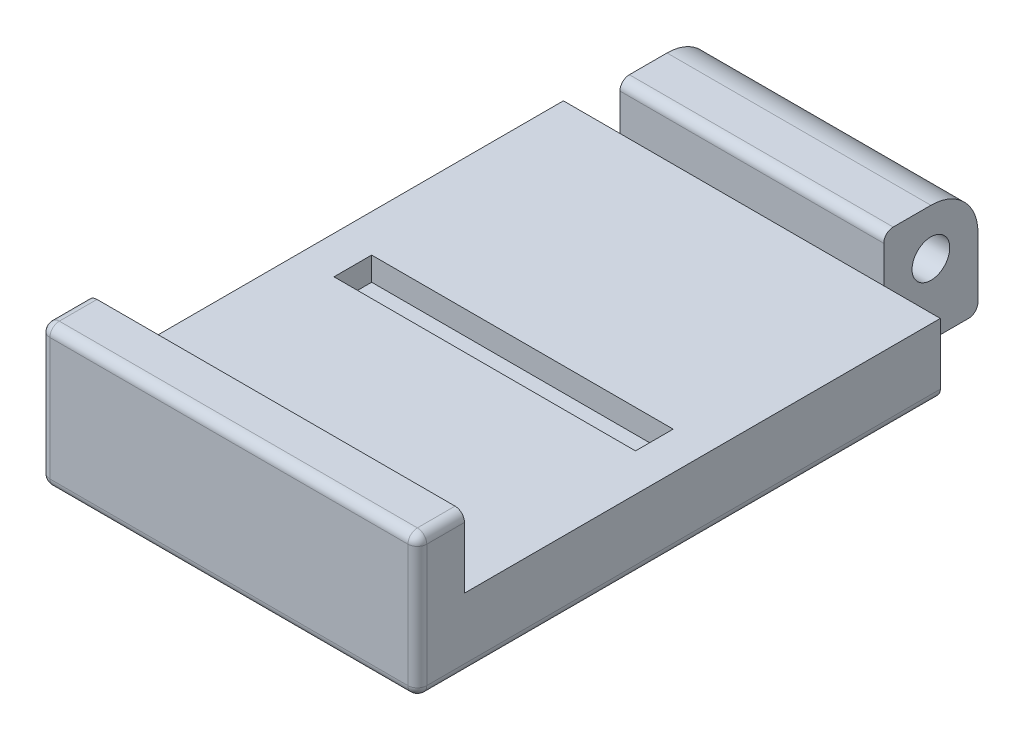
ISO-10303-21;
HEADER;
FILE_DESCRIPTION(('STEP AP214'),'2;1');
FILE_NAME('part.step','',(''),(''),'','','');
FILE_SCHEMA(('AUTOMOTIVE_DESIGN { 1 0 10303 214 1 1 1 1 }'));
ENDSEC;
DATA;
#1=APPLICATION_CONTEXT('core data for automotive mechanical design processes');
#2=APPLICATION_PROTOCOL_DEFINITION('international standard','automotive_design',2000,#1);
#3=PRODUCT_CONTEXT('',#1,'mechanical');
#4=PRODUCT('Part','Part','',(#3));
#5=PRODUCT_RELATED_PRODUCT_CATEGORY('part','',(#4));
#6=PRODUCT_DEFINITION_FORMATION('','',#4);
#7=PRODUCT_DEFINITION_CONTEXT('part definition',#1,'design');
#8=PRODUCT_DEFINITION('design','',#6,#7);
#9=PRODUCT_DEFINITION_SHAPE('','',#8);
#10=(LENGTH_UNIT() NAMED_UNIT(*) SI_UNIT(.MILLI.,.METRE.));
#11=(NAMED_UNIT(*) PLANE_ANGLE_UNIT() SI_UNIT($,.RADIAN.));
#12=(NAMED_UNIT(*) SI_UNIT($,.STERADIAN.) SOLID_ANGLE_UNIT());
#13=UNCERTAINTY_MEASURE_WITH_UNIT(LENGTH_MEASURE(1.E-05),#10,'distance_accuracy_value','');
#14=(GEOMETRIC_REPRESENTATION_CONTEXT(3) GLOBAL_UNCERTAINTY_ASSIGNED_CONTEXT((#13)) GLOBAL_UNIT_ASSIGNED_CONTEXT((#10,
#11,#12)) REPRESENTATION_CONTEXT('',''));
#15=CARTESIAN_POINT('',(0.,0.,0.));
#16=DIRECTION('',(0.,0.,1.));
#17=DIRECTION('',(1.,0.,0.));
#18=AXIS2_PLACEMENT_3D('',#15,#16,#17);
#19=CARTESIAN_POINT('',(0.,0.,0.));
#20=DIRECTION('',(0.,0.,-1.));
#21=DIRECTION('',(-1.,0.,0.));
#22=AXIS2_PLACEMENT_3D('',#19,#20,#21);
#23=PLANE('',#22);
#24=DIRECTION('',(0.,-1.,0.));
#25=VECTOR('',#24,1.);
#26=CARTESIAN_POINT('',(-14.,-7.5,0.));
#27=LINE('',#26,#25);
#28=CARTESIAN_POINT('',(-14.,-0.100000000000001,0.));
#29=VERTEX_POINT('',#28);
#30=CARTESIAN_POINT('',(-14.,-6.5,0.));
#31=VERTEX_POINT('',#30);
#32=EDGE_CURVE('E239',#29,#31,#27,.T.);
#33=ORIENTED_EDGE('',*,*,#32,.F.);
#34=DIRECTION('',(-1.,0.,0.));
#35=VECTOR('',#34,1.);
#36=CARTESIAN_POINT('',(0.,-0.100000000000001,0.));
#37=LINE('',#36,#35);
#38=CARTESIAN_POINT('',(14.,-0.100000000000001,0.));
#39=VERTEX_POINT('',#38);
#40=EDGE_CURVE('E12',#29,#39,#37,.F.);
#41=ORIENTED_EDGE('',*,*,#40,.T.);
#42=DIRECTION('',(0.,-1.,0.));
#43=VECTOR('',#42,1.);
#44=CARTESIAN_POINT('',(14.,0.,0.));
#45=LINE('',#44,#43);
#46=CARTESIAN_POINT('',(14.,-6.5,0.));
#47=VERTEX_POINT('',#46);
#48=EDGE_CURVE('E269',#39,#47,#45,.T.);
#49=ORIENTED_EDGE('',*,*,#48,.T.);
#50=DIRECTION('',(1.,0.,0.));
#51=VECTOR('',#50,1.);
#52=CARTESIAN_POINT('',(-20.,-6.5,0.));
#53=LINE('',#52,#51);
#54=EDGE_CURVE('E337',#47,#31,#53,.F.);
#55=ORIENTED_EDGE('',*,*,#54,.T.);
#56=EDGE_LOOP('',(#33,#41,#49,#55));
#57=FACE_BOUND('',#56,.T.);
#58=ADVANCED_FACE('F34',(#57),#23,.T.);
#59=CARTESIAN_POINT('',(-20.,5.,10.));
#60=DIRECTION('',(0.,0.,-1.));
#61=DIRECTION('',(-1.,0.,0.));
#62=AXIS2_PLACEMENT_3D('',#59,#60,#61);
#63=PLANE('',#62);
#64=DIRECTION('',(0.,1.,0.));
#65=VECTOR('',#64,1.);
#66=CARTESIAN_POINT('',(14.,-7.5,10.));
#67=LINE('',#66,#65);
#68=CARTESIAN_POINT('',(14.,0.,10.));
#69=VERTEX_POINT('',#68);
#70=CARTESIAN_POINT('',(14.,3.9,10.));
#71=VERTEX_POINT('',#70);
#72=EDGE_CURVE('E260',#69,#71,#67,.T.);
#73=ORIENTED_EDGE('',*,*,#72,.T.);
#74=DIRECTION('',(1.,0.,0.));
#75=VECTOR('',#74,1.);
#76=CARTESIAN_POINT('',(-14.,3.9,10.));
#77=LINE('',#76,#75);
#78=CARTESIAN_POINT('',(-14.,3.9,10.));
#79=VERTEX_POINT('',#78);
#80=EDGE_CURVE('E391',#71,#79,#77,.F.);
#81=ORIENTED_EDGE('',*,*,#80,.T.);
#82=DIRECTION('',(0.,-1.,0.));
#83=VECTOR('',#82,1.);
#84=CARTESIAN_POINT('',(-14.,-7.5,10.));
#85=LINE('',#84,#83);
#86=CARTESIAN_POINT('',(-14.,0.,10.));
#87=VERTEX_POINT('',#86);
#88=EDGE_CURVE('E243',#79,#87,#85,.T.);
#89=ORIENTED_EDGE('',*,*,#88,.T.);
#90=DIRECTION('',(1.,0.,0.));
#91=VECTOR('',#90,1.);
#92=CARTESIAN_POINT('',(-20.,0.,10.));
#93=LINE('',#92,#91);
#94=EDGE_CURVE('E289',#87,#69,#93,.T.);
#95=ORIENTED_EDGE('',*,*,#94,.T.);
#96=EDGE_LOOP('',(#73,#81,#89,#95));
#97=FACE_BOUND('',#96,.T.);
#98=ADVANCED_FACE('F412',(#97),#63,.F.);
#99=CARTESIAN_POINT('',(14.,-7.5,-0.999999999999997));
#100=DIRECTION('',(1.,0.,0.));
#101=DIRECTION('',(0.,0.,-1.));
#102=AXIS2_PLACEMENT_3D('',#99,#100,#101);
#103=PLANE('',#102);
#104=CARTESIAN_POINT('',(14.,0.,5.));
#105=DIRECTION('',(1.,0.,0.));
#106=DIRECTION('',(0.,0.,-1.));
#107=AXIS2_PLACEMENT_3D('',#104,#105,#106);
#108=CIRCLE('',#107,2.);
#109=CARTESIAN_POINT('',(14.,0.,3.));
#110=VERTEX_POINT('',#109);
#111=EDGE_CURVE('E236',#110,#110,#108,.T.);
#112=ORIENTED_EDGE('',*,*,#111,.F.);
#113=EDGE_LOOP('',(#112));
#114=FACE_BOUND('',#113,.T.);
#115=DIRECTION('',(0.,0.,1.));
#116=VECTOR('',#115,1.);
#117=CARTESIAN_POINT('',(14.,4.9,-0.999999999999997));
#118=LINE('',#117,#116);
#119=CARTESIAN_POINT('',(14.,4.9,5.));
#120=VERTEX_POINT('',#119);
#121=CARTESIAN_POINT('',(14.,4.9,9.));
#122=VERTEX_POINT('',#121);
#123=EDGE_CURVE('E229',#120,#122,#118,.T.);
#124=ORIENTED_EDGE('',*,*,#123,.T.);
#125=CARTESIAN_POINT('',(14.,3.9,9.));
#126=DIRECTION('',(1.,0.,0.));
#127=DIRECTION('',(0.,0.,-1.));
#128=AXIS2_PLACEMENT_3D('',#125,#126,#127);
#129=CIRCLE('',#128,1.);
#130=EDGE_CURVE('E389',#122,#71,#129,.T.);
#131=ORIENTED_EDGE('',*,*,#130,.T.);
#132=ORIENTED_EDGE('',*,*,#72,.F.);
#133=CARTESIAN_POINT('',(14.,-7.5,10.));
#134=VERTEX_POINT('',#133);
#135=EDGE_CURVE('E261',#134,#69,#67,.T.);
#136=ORIENTED_EDGE('',*,*,#135,.F.);
#137=DIRECTION('',(0.,0.,1.));
#138=VECTOR('',#137,1.);
#139=CARTESIAN_POINT('',(14.,-7.5,-0.999999999999997));
#140=LINE('',#139,#138);
#141=CARTESIAN_POINT('',(14.,-7.5,1.));
#142=VERTEX_POINT('',#141);
#143=EDGE_CURVE('E264',#142,#134,#140,.T.);
#144=ORIENTED_EDGE('',*,*,#143,.F.);
#145=CARTESIAN_POINT('',(14.,-6.5,1.));
#146=DIRECTION('',(1.,0.,0.));
#147=DIRECTION('',(0.,0.,-1.));
#148=AXIS2_PLACEMENT_3D('',#145,#146,#147);
#149=CIRCLE('',#148,1.);
#150=EDGE_CURVE('E271',#47,#142,#149,.F.);
#151=ORIENTED_EDGE('',*,*,#150,.F.);
#152=ORIENTED_EDGE('',*,*,#48,.F.);
#153=CARTESIAN_POINT('',(14.,-0.100000000000001,5.));
#154=DIRECTION('',(1.,0.,0.));
#155=DIRECTION('',(0.,0.,-1.));
#156=AXIS2_PLACEMENT_3D('',#153,#154,#155);
#157=CIRCLE('',#156,5.);
#158=EDGE_CURVE('E387',#39,#120,#157,.T.);
#159=ORIENTED_EDGE('',*,*,#158,.T.);
#160=EDGE_LOOP('',(#124,#131,#132,#136,#144,#151,#152,#159));
#161=FACE_BOUND('',#160,.T.);
#162=ADVANCED_FACE('F408',(#114,#161),#103,.T.);
#163=CARTESIAN_POINT('',(-14.,-7.5,10.));
#164=DIRECTION('',(1.,0.,0.));
#165=DIRECTION('',(0.,1.,0.));
#166=AXIS2_PLACEMENT_3D('',#163,#164,#165);
#167=PLANE('',#166);
#168=CARTESIAN_POINT('',(-14.,0.,5.));
#169=DIRECTION('',(1.,0.,0.));
#170=DIRECTION('',(0.,1.,0.));
#171=AXIS2_PLACEMENT_3D('',#168,#169,#170);
#172=CIRCLE('',#171,2.);
#173=CARTESIAN_POINT('',(-14.,2.,5.));
#174=VERTEX_POINT('',#173);
#175=EDGE_CURVE('E235',#174,#174,#172,.T.);
#176=ORIENTED_EDGE('',*,*,#175,.T.);
#177=EDGE_LOOP('',(#176));
#178=FACE_BOUND('',#177,.T.);
#179=ORIENTED_EDGE('',*,*,#88,.F.);
#180=CARTESIAN_POINT('',(-14.,3.9,9.));
#181=DIRECTION('',(1.,0.,0.));
#182=DIRECTION('',(0.,1.,0.));
#183=AXIS2_PLACEMENT_3D('',#180,#181,#182);
#184=CIRCLE('',#183,1.);
#185=CARTESIAN_POINT('',(-14.,4.9,9.));
#186=VERTEX_POINT('',#185);
#187=EDGE_CURVE('E42',#79,#186,#184,.F.);
#188=ORIENTED_EDGE('',*,*,#187,.T.);
#189=DIRECTION('',(0.,0.,1.));
#190=VECTOR('',#189,1.);
#191=CARTESIAN_POINT('',(-14.,4.9,10.));
#192=LINE('',#191,#190);
#193=CARTESIAN_POINT('',(-14.,4.9,5.));
#194=VERTEX_POINT('',#193);
#195=EDGE_CURVE('E376',#194,#186,#192,.T.);
#196=ORIENTED_EDGE('',*,*,#195,.F.);
#197=CARTESIAN_POINT('',(-14.,-0.100000000000001,5.));
#198=DIRECTION('',(1.,0.,0.));
#199=DIRECTION('',(0.,1.,0.));
#200=AXIS2_PLACEMENT_3D('',#197,#198,#199);
#201=CIRCLE('',#200,5.);
#202=EDGE_CURVE('E57',#194,#29,#201,.F.);
#203=ORIENTED_EDGE('',*,*,#202,.T.);
#204=ORIENTED_EDGE('',*,*,#32,.T.);
#205=CARTESIAN_POINT('',(-14.,-6.5,1.));
#206=DIRECTION('',(1.,0.,0.));
#207=DIRECTION('',(0.,1.,0.));
#208=AXIS2_PLACEMENT_3D('',#205,#206,#207);
#209=CIRCLE('',#208,1.);
#210=CARTESIAN_POINT('',(-14.,-7.5,1.));
#211=VERTEX_POINT('',#210);
#212=EDGE_CURVE('E254',#31,#211,#209,.F.);
#213=ORIENTED_EDGE('',*,*,#212,.T.);
#214=DIRECTION('',(0.,0.,-1.));
#215=VECTOR('',#214,1.);
#216=CARTESIAN_POINT('',(-14.,-7.5,10.));
#217=LINE('',#216,#215);
#218=CARTESIAN_POINT('',(-14.,-7.5,10.));
#219=VERTEX_POINT('',#218);
#220=EDGE_CURVE('E247',#219,#211,#217,.T.);
#221=ORIENTED_EDGE('',*,*,#220,.F.);
#222=EDGE_CURVE('E242',#87,#219,#85,.T.);
#223=ORIENTED_EDGE('',*,*,#222,.F.);
#224=EDGE_LOOP('',(#179,#188,#196,#203,#204,#213,#221,#223));
#225=FACE_BOUND('',#224,.T.);
#226=ADVANCED_FACE('F395',(#178,#225),#167,.F.);
#227=CARTESIAN_POINT('',(-20.,-7.5,65.5));
#228=DIRECTION('',(1.,0.,0.));
#229=DIRECTION('',(0.,0.,-1.));
#230=AXIS2_PLACEMENT_3D('',#227,#228,#229);
#231=PLANE('',#230);
#232=DIRECTION('',(0.,1.,0.));
#233=VECTOR('',#232,1.);
#234=CARTESIAN_POINT('',(-20.,-7.5,10.));
#235=LINE('',#234,#233);
#236=CARTESIAN_POINT('',(-20.,-6.5,10.));
#237=VERTEX_POINT('',#236);
#238=CARTESIAN_POINT('',(-20.,0.,10.));
#239=VERTEX_POINT('',#238);
#240=EDGE_CURVE('E240',#237,#239,#235,.T.);
#241=ORIENTED_EDGE('',*,*,#240,.F.);
#242=DIRECTION('',(0.,0.,-1.));
#243=VECTOR('',#242,1.);
#244=CARTESIAN_POINT('',(-20.,-6.5,65.5));
#245=LINE('',#244,#243);
#246=CARTESIAN_POINT('',(-20.,-6.5,64.5));
#247=VERTEX_POINT('',#246);
#248=EDGE_CURVE('E330',#237,#247,#245,.F.);
#249=ORIENTED_EDGE('',*,*,#248,.T.);
#250=DIRECTION('',(0.,-1.,0.));
#251=VECTOR('',#250,1.);
#252=CARTESIAN_POINT('',(-20.,-7.5,64.5));
#253=LINE('',#252,#251);
#254=CARTESIAN_POINT('',(-20.,6.5,64.5));
#255=VERTEX_POINT('',#254);
#256=EDGE_CURVE('E332',#247,#255,#253,.F.);
#257=ORIENTED_EDGE('',*,*,#256,.T.);
#258=DIRECTION('',(0.,0.,-1.));
#259=VECTOR('',#258,1.);
#260=CARTESIAN_POINT('',(-20.,6.5,65.5));
#261=LINE('',#260,#259);
#262=CARTESIAN_POINT('',(-20.,6.5,60.5));
#263=VERTEX_POINT('',#262);
#264=EDGE_CURVE('E334',#255,#263,#261,.T.);
#265=ORIENTED_EDGE('',*,*,#264,.T.);
#266=DIRECTION('',(0.,-1.,0.));
#267=VECTOR('',#266,1.);
#268=CARTESIAN_POINT('',(-20.,7.49999999999999,60.5));
#269=LINE('',#268,#267);
#270=CARTESIAN_POINT('',(-20.,0.,60.5));
#271=VERTEX_POINT('',#270);
#272=EDGE_CURVE('E275',#263,#271,#269,.T.);
#273=ORIENTED_EDGE('',*,*,#272,.T.);
#274=DIRECTION('',(0.,0.,-1.));
#275=VECTOR('',#274,1.);
#276=CARTESIAN_POINT('',(-20.,0.,60.5));
#277=LINE('',#276,#275);
#278=EDGE_CURVE('E277',#271,#239,#277,.T.);
#279=ORIENTED_EDGE('',*,*,#278,.T.);
#280=EDGE_LOOP('',(#241,#249,#257,#265,#273,#279));
#281=FACE_BOUND('',#280,.T.);
#282=ADVANCED_FACE('F447',(#281),#231,.F.);
#283=CARTESIAN_POINT('',(-19.,-6.5,65.5));
#284=DIRECTION('',(0.,0.,-1.));
#285=DIRECTION('',(-1.,0.,0.));
#286=AXIS2_PLACEMENT_3D('',#283,#284,#285);
#287=CYLINDRICAL_SURFACE('',#286,1.);
#288=ORIENTED_EDGE('',*,*,#248,.F.);
#289=CARTESIAN_POINT('',(-19.,-6.5,10.));
#290=DIRECTION('',(0.,0.,-1.));
#291=DIRECTION('',(-1.,0.,0.));
#292=AXIS2_PLACEMENT_3D('',#289,#290,#291);
#293=CIRCLE('',#292,1.);
#294=CARTESIAN_POINT('',(-19.,-7.5,10.));
#295=VERTEX_POINT('',#294);
#296=EDGE_CURVE('E251',#237,#295,#293,.F.);
#297=ORIENTED_EDGE('',*,*,#296,.T.);
#298=DIRECTION('',(0.,0.,-1.));
#299=VECTOR('',#298,1.);
#300=CARTESIAN_POINT('',(-19.,-7.5,65.5));
#301=LINE('',#300,#299);
#302=CARTESIAN_POINT('',(-19.,-7.5,64.5));
#303=VERTEX_POINT('',#302);
#304=EDGE_CURVE('E314',#303,#295,#301,.T.);
#305=ORIENTED_EDGE('',*,*,#304,.F.);
#306=CARTESIAN_POINT('',(-19.,-6.5,64.5));
#307=DIRECTION('',(0.,0.,1.));
#308=DIRECTION('',(1.,0.,0.));
#309=AXIS2_PLACEMENT_3D('',#306,#307,#308);
#310=CIRCLE('',#309,1.);
#311=EDGE_CURVE('E300',#247,#303,#310,.T.);
#312=ORIENTED_EDGE('',*,*,#311,.F.);
#313=EDGE_LOOP('',(#288,#297,#305,#312));
#314=FACE_BOUND('',#313,.T.);
#315=ADVANCED_FACE('F443',(#314),#287,.T.);
#316=CARTESIAN_POINT('',(-20.,-7.5,65.5));
#317=DIRECTION('',(0.,1.,0.));
#318=DIRECTION('',(0.,0.,1.));
#319=AXIS2_PLACEMENT_3D('',#316,#317,#318);
#320=PLANE('',#319);
#321=DIRECTION('',(-1.,0.,0.));
#322=VECTOR('',#321,1.);
#323=CARTESIAN_POINT('',(-20.,-7.5,10.));
#324=LINE('',#323,#322);
#325=EDGE_CURVE('E245',#219,#295,#324,.T.);
#326=ORIENTED_EDGE('',*,*,#325,.F.);
#327=ORIENTED_EDGE('',*,*,#220,.T.);
#328=DIRECTION('',(1.,0.,0.));
#329=VECTOR('',#328,1.);
#330=CARTESIAN_POINT('',(20.,-7.5,1.));
#331=LINE('',#330,#329);
#332=EDGE_CURVE('E312',#211,#142,#331,.T.);
#333=ORIENTED_EDGE('',*,*,#332,.T.);
#334=ORIENTED_EDGE('',*,*,#143,.T.);
#335=DIRECTION('',(-1.,0.,0.));
#336=VECTOR('',#335,1.);
#337=CARTESIAN_POINT('',(20.,-7.5,10.));
#338=LINE('',#337,#336);
#339=CARTESIAN_POINT('',(19.,-7.5,10.));
#340=VERTEX_POINT('',#339);
#341=EDGE_CURVE('E258',#340,#134,#338,.T.);
#342=ORIENTED_EDGE('',*,*,#341,.F.);
#343=DIRECTION('',(0.,0.,-1.));
#344=VECTOR('',#343,1.);
#345=CARTESIAN_POINT('',(19.,-7.5,65.5));
#346=LINE('',#345,#344);
#347=CARTESIAN_POINT('',(19.,-7.5,64.5));
#348=VERTEX_POINT('',#347);
#349=EDGE_CURVE('E319',#340,#348,#346,.F.);
#350=ORIENTED_EDGE('',*,*,#349,.T.);
#351=DIRECTION('',(1.,0.,0.));
#352=VECTOR('',#351,1.);
#353=CARTESIAN_POINT('',(-20.,-7.5,64.5));
#354=LINE('',#353,#352);
#355=EDGE_CURVE('E317',#348,#303,#354,.F.);
#356=ORIENTED_EDGE('',*,*,#355,.T.);
#357=ORIENTED_EDGE('',*,*,#304,.T.);
#358=EDGE_LOOP('',(#326,#327,#333,#334,#342,#350,#356,#357));
#359=FACE_BOUND('',#358,.T.);
#360=ADVANCED_FACE('F424',(#359),#320,.F.);
#361=CARTESIAN_POINT('',(-20.,-6.5,1.));
#362=DIRECTION('',(-1.,0.,0.));
#363=DIRECTION('',(0.,0.,1.));
#364=AXIS2_PLACEMENT_3D('',#361,#362,#363);
#365=CYLINDRICAL_SURFACE('',#364,1.);
#366=ORIENTED_EDGE('',*,*,#212,.F.);
#367=ORIENTED_EDGE('',*,*,#54,.F.);
#368=ORIENTED_EDGE('',*,*,#150,.T.);
#369=ORIENTED_EDGE('',*,*,#332,.F.);
#370=EDGE_LOOP('',(#366,#367,#368,#369));
#371=FACE_BOUND('',#370,.T.);
#372=ADVANCED_FACE('F430',(#371),#365,.T.);
#373=CARTESIAN_POINT('',(20.,-7.5,65.5));
#374=DIRECTION('',(-1.,0.,0.));
#375=DIRECTION('',(0.,0.,1.));
#376=AXIS2_PLACEMENT_3D('',#373,#374,#375);
#377=PLANE('',#376);
#378=DIRECTION('',(0.,0.,-1.));
#379=VECTOR('',#378,1.);
#380=CARTESIAN_POINT('',(20.,-6.5,65.5));
#381=LINE('',#380,#379);
#382=CARTESIAN_POINT('',(20.,-6.5,64.5));
#383=VERTEX_POINT('',#382);
#384=CARTESIAN_POINT('',(20.,-6.5,10.));
#385=VERTEX_POINT('',#384);
#386=EDGE_CURVE('E305',#383,#385,#381,.T.);
#387=ORIENTED_EDGE('',*,*,#386,.T.);
#388=DIRECTION('',(0.,-1.,0.));
#389=VECTOR('',#388,1.);
#390=CARTESIAN_POINT('',(20.,-7.5,10.));
#391=LINE('',#390,#389);
#392=CARTESIAN_POINT('',(20.,0.,10.));
#393=VERTEX_POINT('',#392);
#394=EDGE_CURVE('E256',#393,#385,#391,.T.);
#395=ORIENTED_EDGE('',*,*,#394,.F.);
#396=DIRECTION('',(0.,0.,-1.));
#397=VECTOR('',#396,1.);
#398=CARTESIAN_POINT('',(20.,0.,55.501553512185));
#399=LINE('',#398,#397);
#400=CARTESIAN_POINT('',(20.,0.,60.5));
#401=VERTEX_POINT('',#400);
#402=EDGE_CURVE('E278',#401,#393,#399,.T.);
#403=ORIENTED_EDGE('',*,*,#402,.F.);
#404=DIRECTION('',(0.,-1.,0.));
#405=VECTOR('',#404,1.);
#406=CARTESIAN_POINT('',(20.,7.49999999999999,60.5));
#407=LINE('',#406,#405);
#408=CARTESIAN_POINT('',(20.,6.5,60.5));
#409=VERTEX_POINT('',#408);
#410=EDGE_CURVE('E274',#409,#401,#407,.T.);
#411=ORIENTED_EDGE('',*,*,#410,.F.);
#412=DIRECTION('',(0.,0.,-1.));
#413=VECTOR('',#412,1.);
#414=CARTESIAN_POINT('',(20.,6.5,65.5));
#415=LINE('',#414,#413);
#416=CARTESIAN_POINT('',(20.,6.5,64.5));
#417=VERTEX_POINT('',#416);
#418=EDGE_CURVE('E308',#409,#417,#415,.F.);
#419=ORIENTED_EDGE('',*,*,#418,.T.);
#420=DIRECTION('',(0.,1.,0.));
#421=VECTOR('',#420,1.);
#422=CARTESIAN_POINT('',(20.,-7.5,64.5));
#423=LINE('',#422,#421);
#424=EDGE_CURVE('E310',#417,#383,#423,.F.);
#425=ORIENTED_EDGE('',*,*,#424,.T.);
#426=EDGE_LOOP('',(#387,#395,#403,#411,#419,#425));
#427=FACE_BOUND('',#426,.T.);
#428=ADVANCED_FACE('F457',(#427),#377,.F.);
#429=CARTESIAN_POINT('',(-20.,7.5,65.5));
#430=DIRECTION('',(0.,-1.,0.));
#431=DIRECTION('',(0.,0.,-1.));
#432=AXIS2_PLACEMENT_3D('',#429,#430,#431);
#433=PLANE('',#432);
#434=DIRECTION('',(0.,0.,-1.));
#435=VECTOR('',#434,1.);
#436=CARTESIAN_POINT('',(19.,7.5,65.5));
#437=LINE('',#436,#435);
#438=CARTESIAN_POINT('',(19.,7.5,64.5));
#439=VERTEX_POINT('',#438);
#440=CARTESIAN_POINT('',(19.,7.5,60.5));
#441=VERTEX_POINT('',#440);
#442=EDGE_CURVE('E302',#439,#441,#437,.T.);
#443=ORIENTED_EDGE('',*,*,#442,.T.);
#444=DIRECTION('',(1.,0.,0.));
#445=VECTOR('',#444,1.);
#446=CARTESIAN_POINT('',(-20.,7.49999999999999,60.5));
#447=LINE('',#446,#445);
#448=CARTESIAN_POINT('',(-19.,7.49999999999999,60.5));
#449=VERTEX_POINT('',#448);
#450=EDGE_CURVE('E281',#449,#441,#447,.T.);
#451=ORIENTED_EDGE('',*,*,#450,.F.);
#452=DIRECTION('',(0.,0.,-1.));
#453=VECTOR('',#452,1.);
#454=CARTESIAN_POINT('',(-19.,7.5,65.5));
#455=LINE('',#454,#453);
#456=CARTESIAN_POINT('',(-19.,7.5,64.5));
#457=VERTEX_POINT('',#456);
#458=EDGE_CURVE('E297',#449,#457,#455,.F.);
#459=ORIENTED_EDGE('',*,*,#458,.T.);
#460=DIRECTION('',(-1.,0.,0.));
#461=VECTOR('',#460,1.);
#462=CARTESIAN_POINT('',(-20.,7.5,64.5));
#463=LINE('',#462,#461);
#464=EDGE_CURVE('E299',#457,#439,#463,.F.);
#465=ORIENTED_EDGE('',*,*,#464,.T.);
#466=EDGE_LOOP('',(#443,#451,#459,#465));
#467=FACE_BOUND('',#466,.T.);
#468=ADVANCED_FACE('F489',(#467),#433,.F.);
#469=CARTESIAN_POINT('',(0.,0.,65.5));
#470=DIRECTION('',(0.,0.,-1.));
#471=DIRECTION('',(-1.,0.,0.));
#472=AXIS2_PLACEMENT_3D('',#469,#470,#471);
#473=PLANE('',#472);
#474=DIRECTION('',(1.,0.,0.));
#475=VECTOR('',#474,1.);
#476=CARTESIAN_POINT('',(0.,-6.5,65.5));
#477=LINE('',#476,#475);
#478=CARTESIAN_POINT('',(-19.,-6.5,65.5));
#479=VERTEX_POINT('',#478);
#480=CARTESIAN_POINT('',(19.,-6.5,65.5));
#481=VERTEX_POINT('',#480);
#482=EDGE_CURVE('E325',#479,#481,#477,.T.);
#483=ORIENTED_EDGE('',*,*,#482,.T.);
#484=DIRECTION('',(0.,1.,0.));
#485=VECTOR('',#484,1.);
#486=CARTESIAN_POINT('',(19.,0.,65.5));
#487=LINE('',#486,#485);
#488=CARTESIAN_POINT('',(19.,6.5,65.5));
#489=VERTEX_POINT('',#488);
#490=EDGE_CURVE('E328',#481,#489,#487,.T.);
#491=ORIENTED_EDGE('',*,*,#490,.T.);
#492=DIRECTION('',(-1.,0.,0.));
#493=VECTOR('',#492,1.);
#494=CARTESIAN_POINT('',(0.,6.5,65.5));
#495=LINE('',#494,#493);
#496=CARTESIAN_POINT('',(-19.,6.5,65.5));
#497=VERTEX_POINT('',#496);
#498=EDGE_CURVE('E323',#489,#497,#495,.T.);
#499=ORIENTED_EDGE('',*,*,#498,.T.);
#500=DIRECTION('',(0.,-1.,0.));
#501=VECTOR('',#500,1.);
#502=CARTESIAN_POINT('',(-19.,0.,65.5));
#503=LINE('',#502,#501);
#504=EDGE_CURVE('E321',#497,#479,#503,.T.);
#505=ORIENTED_EDGE('',*,*,#504,.T.);
#506=EDGE_LOOP('',(#483,#491,#499,#505));
#507=FACE_BOUND('',#506,.T.);
#508=ADVANCED_FACE('F473',(#507),#473,.F.);
#509=CARTESIAN_POINT('',(-19.,-6.5,64.5));
#510=DIRECTION('',(0.,0.,1.));
#511=DIRECTION('',(1.,0.,0.));
#512=AXIS2_PLACEMENT_3D('',#509,#510,#511);
#513=SPHERICAL_SURFACE('',#512,1.);
#514=CARTESIAN_POINT('',(-19.,-6.5,64.5));
#515=DIRECTION('',(0.,-1.,0.));
#516=DIRECTION('',(0.,0.,-1.));
#517=AXIS2_PLACEMENT_3D('',#514,#515,#516);
#518=CIRCLE('',#517,1.);
#519=EDGE_CURVE('E367',#247,#479,#518,.F.);
#520=ORIENTED_EDGE('',*,*,#519,.F.);
#521=ORIENTED_EDGE('',*,*,#311,.T.);
#522=CARTESIAN_POINT('',(-19.,-6.5,64.5));
#523=DIRECTION('',(-1.,0.,0.));
#524=DIRECTION('',(0.,0.,1.));
#525=AXIS2_PLACEMENT_3D('',#522,#523,#524);
#526=CIRCLE('',#525,1.);
#527=EDGE_CURVE('E370',#479,#303,#526,.F.);
#528=ORIENTED_EDGE('',*,*,#527,.F.);
#529=EDGE_LOOP('',(#520,#521,#528));
#530=FACE_BOUND('',#529,.T.);
#531=ADVANCED_FACE('F481',(#530),#513,.T.);
#532=CARTESIAN_POINT('',(0.,-6.5,64.5));
#533=DIRECTION('',(1.,0.,0.));
#534=DIRECTION('',(0.,0.,-1.));
#535=AXIS2_PLACEMENT_3D('',#532,#533,#534);
#536=CYLINDRICAL_SURFACE('',#535,1.);
#537=ORIENTED_EDGE('',*,*,#527,.T.);
#538=ORIENTED_EDGE('',*,*,#355,.F.);
#539=CARTESIAN_POINT('',(19.,-6.5,64.5));
#540=DIRECTION('',(1.,0.,0.));
#541=DIRECTION('',(0.,0.,-1.));
#542=AXIS2_PLACEMENT_3D('',#539,#540,#541);
#543=CIRCLE('',#542,1.);
#544=EDGE_CURVE('E361',#481,#348,#543,.T.);
#545=ORIENTED_EDGE('',*,*,#544,.F.);
#546=ORIENTED_EDGE('',*,*,#482,.F.);
#547=EDGE_LOOP('',(#537,#538,#545,#546));
#548=FACE_BOUND('',#547,.T.);
#549=ADVANCED_FACE('F471',(#548),#536,.T.);
#550=CARTESIAN_POINT('',(-19.,0.,64.5));
#551=DIRECTION('',(0.,-1.,0.));
#552=DIRECTION('',(0.,0.,-1.));
#553=AXIS2_PLACEMENT_3D('',#550,#551,#552);
#554=CYLINDRICAL_SURFACE('',#553,1.);
#555=ORIENTED_EDGE('',*,*,#519,.T.);
#556=ORIENTED_EDGE('',*,*,#504,.F.);
#557=CARTESIAN_POINT('',(-19.,6.5,64.5));
#558=DIRECTION('',(0.,1.,0.));
#559=DIRECTION('',(0.,0.,1.));
#560=AXIS2_PLACEMENT_3D('',#557,#558,#559);
#561=CIRCLE('',#560,1.);
#562=EDGE_CURVE('E358',#255,#497,#561,.T.);
#563=ORIENTED_EDGE('',*,*,#562,.F.);
#564=ORIENTED_EDGE('',*,*,#256,.F.);
#565=EDGE_LOOP('',(#555,#556,#563,#564));
#566=FACE_BOUND('',#565,.T.);
#567=ADVANCED_FACE('F479',(#566),#554,.T.);
#568=CARTESIAN_POINT('',(-19.,6.5,65.5));
#569=DIRECTION('',(0.,0.,-1.));
#570=DIRECTION('',(-1.,0.,0.));
#571=AXIS2_PLACEMENT_3D('',#568,#569,#570);
#572=CYLINDRICAL_SURFACE('',#571,1.);
#573=CARTESIAN_POINT('',(-19.,6.5,60.5));
#574=DIRECTION('',(0.,0.,1.));
#575=DIRECTION('',(1.,0.,0.));
#576=AXIS2_PLACEMENT_3D('',#573,#574,#575);
#577=CIRCLE('',#576,1.);
#578=EDGE_CURVE('E288',#263,#449,#577,.F.);
#579=ORIENTED_EDGE('',*,*,#578,.F.);
#580=ORIENTED_EDGE('',*,*,#264,.F.);
#581=CARTESIAN_POINT('',(-19.,6.5,64.5));
#582=DIRECTION('',(0.,0.,1.));
#583=DIRECTION('',(1.,0.,0.));
#584=AXIS2_PLACEMENT_3D('',#581,#582,#583);
#585=CIRCLE('',#584,1.);
#586=EDGE_CURVE('E355',#457,#255,#585,.T.);
#587=ORIENTED_EDGE('',*,*,#586,.F.);
#588=ORIENTED_EDGE('',*,*,#458,.F.);
#589=EDGE_LOOP('',(#579,#580,#587,#588));
#590=FACE_BOUND('',#589,.T.);
#591=ADVANCED_FACE('F533',(#590),#572,.T.);
#592=CARTESIAN_POINT('',(19.,-6.5,65.5));
#593=DIRECTION('',(0.,0.,-1.));
#594=DIRECTION('',(-1.,0.,0.));
#595=AXIS2_PLACEMENT_3D('',#592,#593,#594);
#596=CYLINDRICAL_SURFACE('',#595,1.);
#597=CARTESIAN_POINT('',(19.,-6.5,10.));
#598=DIRECTION('',(0.,0.,1.));
#599=DIRECTION('',(1.,0.,0.));
#600=AXIS2_PLACEMENT_3D('',#597,#598,#599);
#601=CIRCLE('',#600,1.);
#602=EDGE_CURVE('E267',#385,#340,#601,.F.);
#603=ORIENTED_EDGE('',*,*,#602,.F.);
#604=ORIENTED_EDGE('',*,*,#386,.F.);
#605=CARTESIAN_POINT('',(19.,-6.5,64.5));
#606=DIRECTION('',(0.,0.,1.));
#607=DIRECTION('',(1.,0.,0.));
#608=AXIS2_PLACEMENT_3D('',#605,#606,#607);
#609=CIRCLE('',#608,1.);
#610=EDGE_CURVE('E364',#348,#383,#609,.T.);
#611=ORIENTED_EDGE('',*,*,#610,.F.);
#612=ORIENTED_EDGE('',*,*,#349,.F.);
#613=EDGE_LOOP('',(#603,#604,#611,#612));
#614=FACE_BOUND('',#613,.T.);
#615=ADVANCED_FACE('F462',(#614),#596,.T.);
#616=CARTESIAN_POINT('',(19.,-6.5,64.5));
#617=DIRECTION('',(0.,0.,1.));
#618=DIRECTION('',(1.,0.,0.));
#619=AXIS2_PLACEMENT_3D('',#616,#617,#618);
#620=SPHERICAL_SURFACE('',#619,1.);
#621=ORIENTED_EDGE('',*,*,#544,.T.);
#622=ORIENTED_EDGE('',*,*,#610,.T.);
#623=CARTESIAN_POINT('',(19.,-6.5,64.5));
#624=DIRECTION('',(0.,-1.,0.));
#625=DIRECTION('',(0.,0.,-1.));
#626=AXIS2_PLACEMENT_3D('',#623,#624,#625);
#627=CIRCLE('',#626,1.);
#628=EDGE_CURVE('E352',#481,#383,#627,.F.);
#629=ORIENTED_EDGE('',*,*,#628,.F.);
#630=EDGE_LOOP('',(#621,#622,#629));
#631=FACE_BOUND('',#630,.T.);
#632=ADVANCED_FACE('F468',(#631),#620,.T.);
#633=CARTESIAN_POINT('',(-19.,6.5,64.5));
#634=DIRECTION('',(0.,0.,1.));
#635=DIRECTION('',(1.,0.,0.));
#636=AXIS2_PLACEMENT_3D('',#633,#634,#635);
#637=SPHERICAL_SURFACE('',#636,1.);
#638=ORIENTED_EDGE('',*,*,#586,.T.);
#639=ORIENTED_EDGE('',*,*,#562,.T.);
#640=CARTESIAN_POINT('',(-19.,6.5,64.5));
#641=DIRECTION('',(-1.,0.,0.));
#642=DIRECTION('',(0.,0.,1.));
#643=AXIS2_PLACEMENT_3D('',#640,#641,#642);
#644=CIRCLE('',#643,1.);
#645=EDGE_CURVE('E349',#457,#497,#644,.F.);
#646=ORIENTED_EDGE('',*,*,#645,.F.);
#647=EDGE_LOOP('',(#638,#639,#646));
#648=FACE_BOUND('',#647,.T.);
#649=ADVANCED_FACE('F524',(#648),#637,.T.);
#650=CARTESIAN_POINT('',(19.,0.,64.5));
#651=DIRECTION('',(0.,1.,0.));
#652=DIRECTION('',(0.,0.,1.));
#653=AXIS2_PLACEMENT_3D('',#650,#651,#652);
#654=CYLINDRICAL_SURFACE('',#653,1.);
#655=ORIENTED_EDGE('',*,*,#628,.T.);
#656=ORIENTED_EDGE('',*,*,#424,.F.);
#657=CARTESIAN_POINT('',(19.,6.5,64.5));
#658=DIRECTION('',(0.,1.,0.));
#659=DIRECTION('',(0.,0.,1.));
#660=AXIS2_PLACEMENT_3D('',#657,#658,#659);
#661=CIRCLE('',#660,1.);
#662=EDGE_CURVE('E346',#489,#417,#661,.T.);
#663=ORIENTED_EDGE('',*,*,#662,.F.);
#664=ORIENTED_EDGE('',*,*,#490,.F.);
#665=EDGE_LOOP('',(#655,#656,#663,#664));
#666=FACE_BOUND('',#665,.T.);
#667=ADVANCED_FACE('F520',(#666),#654,.T.);
#668=CARTESIAN_POINT('',(0.,6.5,64.5));
#669=DIRECTION('',(-1.,0.,0.));
#670=DIRECTION('',(0.,0.,1.));
#671=AXIS2_PLACEMENT_3D('',#668,#669,#670);
#672=CYLINDRICAL_SURFACE('',#671,1.);
#673=ORIENTED_EDGE('',*,*,#645,.T.);
#674=ORIENTED_EDGE('',*,*,#498,.F.);
#675=CARTESIAN_POINT('',(19.,6.5,64.5));
#676=DIRECTION('',(1.,0.,0.));
#677=DIRECTION('',(0.,0.,-1.));
#678=AXIS2_PLACEMENT_3D('',#675,#676,#677);
#679=CIRCLE('',#678,1.);
#680=EDGE_CURVE('E343',#439,#489,#679,.T.);
#681=ORIENTED_EDGE('',*,*,#680,.F.);
#682=ORIENTED_EDGE('',*,*,#464,.F.);
#683=EDGE_LOOP('',(#673,#674,#681,#682));
#684=FACE_BOUND('',#683,.T.);
#685=ADVANCED_FACE('F516',(#684),#672,.T.);
#686=CARTESIAN_POINT('',(19.,6.5,64.5));
#687=DIRECTION('',(0.,0.,1.));
#688=DIRECTION('',(1.,0.,0.));
#689=AXIS2_PLACEMENT_3D('',#686,#687,#688);
#690=SPHERICAL_SURFACE('',#689,1.);
#691=ORIENTED_EDGE('',*,*,#680,.T.);
#692=ORIENTED_EDGE('',*,*,#662,.T.);
#693=CARTESIAN_POINT('',(19.,6.5,64.5));
#694=DIRECTION('',(0.,0.,1.));
#695=DIRECTION('',(1.,0.,0.));
#696=AXIS2_PLACEMENT_3D('',#693,#694,#695);
#697=CIRCLE('',#696,1.);
#698=EDGE_CURVE('E296',#439,#417,#697,.F.);
#699=ORIENTED_EDGE('',*,*,#698,.F.);
#700=EDGE_LOOP('',(#691,#692,#699));
#701=FACE_BOUND('',#700,.T.);
#702=ADVANCED_FACE('F512',(#701),#690,.T.);
#703=CARTESIAN_POINT('',(19.,6.5,65.5));
#704=DIRECTION('',(0.,0.,-1.));
#705=DIRECTION('',(-1.,0.,0.));
#706=AXIS2_PLACEMENT_3D('',#703,#704,#705);
#707=CYLINDRICAL_SURFACE('',#706,1.);
#708=CARTESIAN_POINT('',(19.,6.5,60.5));
#709=DIRECTION('',(0.,0.,1.));
#710=DIRECTION('',(1.,0.,0.));
#711=AXIS2_PLACEMENT_3D('',#708,#709,#710);
#712=CIRCLE('',#711,1.);
#713=EDGE_CURVE('E340',#441,#409,#712,.F.);
#714=ORIENTED_EDGE('',*,*,#713,.F.);
#715=ORIENTED_EDGE('',*,*,#442,.F.);
#716=ORIENTED_EDGE('',*,*,#698,.T.);
#717=ORIENTED_EDGE('',*,*,#418,.F.);
#718=EDGE_LOOP('',(#714,#715,#716,#717));
#719=FACE_BOUND('',#718,.T.);
#720=ADVANCED_FACE('F509',(#719),#707,.T.);
#721=CARTESIAN_POINT('',(-20.,0.,55.501553512185));
#722=DIRECTION('',(0.,-1.,0.));
#723=DIRECTION('',(0.,0.,-1.));
#724=AXIS2_PLACEMENT_3D('',#721,#722,#723);
#725=PLANE('',#724);
#726=DIRECTION('',(1.,0.,0.));
#727=VECTOR('',#726,1.);
#728=CARTESIAN_POINT('',(-16.,0.,38.35));
#729=LINE('',#728,#727);
#730=CARTESIAN_POINT('',(-16.,0.,38.35));
#731=VERTEX_POINT('',#730);
#732=CARTESIAN_POINT('',(16.,0.,38.35));
#733=VERTEX_POINT('',#732);
#734=EDGE_CURVE('E223',#731,#733,#729,.T.);
#735=ORIENTED_EDGE('',*,*,#734,.F.);
#736=DIRECTION('',(0.,0.,1.));
#737=VECTOR('',#736,1.);
#738=CARTESIAN_POINT('',(-16.,0.,34.35));
#739=LINE('',#738,#737);
#740=CARTESIAN_POINT('',(-16.,0.,34.35));
#741=VERTEX_POINT('',#740);
#742=EDGE_CURVE('E49',#741,#731,#739,.T.);
#743=ORIENTED_EDGE('',*,*,#742,.F.);
#744=DIRECTION('',(-1.,0.,0.));
#745=VECTOR('',#744,1.);
#746=CARTESIAN_POINT('',(-16.,0.,34.35));
#747=LINE('',#746,#745);
#748=CARTESIAN_POINT('',(16.,0.,34.35));
#749=VERTEX_POINT('',#748);
#750=EDGE_CURVE('E214',#749,#741,#747,.T.);
#751=ORIENTED_EDGE('',*,*,#750,.F.);
#752=DIRECTION('',(0.,0.,-1.));
#753=VECTOR('',#752,1.);
#754=CARTESIAN_POINT('',(16.,0.,34.35));
#755=LINE('',#754,#753);
#756=EDGE_CURVE('E217',#733,#749,#755,.T.);
#757=ORIENTED_EDGE('',*,*,#756,.F.);
#758=EDGE_LOOP('',(#735,#743,#751,#757));
#759=FACE_BOUND('',#758,.T.);
#760=ORIENTED_EDGE('',*,*,#402,.T.);
#761=EDGE_CURVE('E290',#69,#393,#93,.T.);
#762=ORIENTED_EDGE('',*,*,#761,.F.);
#763=ORIENTED_EDGE('',*,*,#94,.F.);
#764=EDGE_CURVE('E285',#239,#87,#93,.T.);
#765=ORIENTED_EDGE('',*,*,#764,.F.);
#766=ORIENTED_EDGE('',*,*,#278,.F.);
#767=DIRECTION('',(1.,0.,0.));
#768=VECTOR('',#767,1.);
#769=CARTESIAN_POINT('',(-20.,0.,60.5));
#770=LINE('',#769,#768);
#771=EDGE_CURVE('E291',#271,#401,#770,.T.);
#772=ORIENTED_EDGE('',*,*,#771,.T.);
#773=EDGE_LOOP('',(#760,#762,#763,#765,#766,#772));
#774=FACE_BOUND('',#773,.T.);
#775=ADVANCED_FACE('F451',(#759,#774),#725,.F.);
#776=CARTESIAN_POINT('',(-20.,7.49999999999999,60.5));
#777=DIRECTION('',(0.,0.,1.));
#778=DIRECTION('',(1.,0.,0.));
#779=AXIS2_PLACEMENT_3D('',#776,#777,#778);
#780=PLANE('',#779);
#781=ORIENTED_EDGE('',*,*,#410,.T.);
#782=ORIENTED_EDGE('',*,*,#771,.F.);
#783=ORIENTED_EDGE('',*,*,#272,.F.);
#784=ORIENTED_EDGE('',*,*,#578,.T.);
#785=ORIENTED_EDGE('',*,*,#450,.T.);
#786=ORIENTED_EDGE('',*,*,#713,.T.);
#787=EDGE_LOOP('',(#781,#782,#783,#784,#785,#786));
#788=FACE_BOUND('',#787,.T.);
#789=ADVANCED_FACE('F584',(#788),#780,.F.);
#790=CARTESIAN_POINT('',(0.,0.,10.));
#791=DIRECTION('',(0.,0.,1.));
#792=DIRECTION('',(1.,0.,0.));
#793=AXIS2_PLACEMENT_3D('',#790,#791,#792);
#794=PLANE('',#793);
#795=ORIENTED_EDGE('',*,*,#602,.T.);
#796=ORIENTED_EDGE('',*,*,#341,.T.);
#797=ORIENTED_EDGE('',*,*,#135,.T.);
#798=ORIENTED_EDGE('',*,*,#761,.T.);
#799=ORIENTED_EDGE('',*,*,#394,.T.);
#800=EDGE_LOOP('',(#795,#796,#797,#798,#799));
#801=FACE_BOUND('',#800,.T.);
#802=ADVANCED_FACE('F417',(#801),#794,.F.);
#803=CARTESIAN_POINT('',(0.,0.,10.));
#804=DIRECTION('',(0.,0.,-1.));
#805=DIRECTION('',(-1.,0.,0.));
#806=AXIS2_PLACEMENT_3D('',#803,#804,#805);
#807=PLANE('',#806);
#808=ORIENTED_EDGE('',*,*,#240,.T.);
#809=ORIENTED_EDGE('',*,*,#764,.T.);
#810=ORIENTED_EDGE('',*,*,#222,.T.);
#811=ORIENTED_EDGE('',*,*,#325,.T.);
#812=ORIENTED_EDGE('',*,*,#296,.F.);
#813=EDGE_LOOP('',(#808,#809,#810,#811,#812));
#814=FACE_BOUND('',#813,.T.);
#815=ADVANCED_FACE('F439',(#814),#807,.T.);
#816=CARTESIAN_POINT('',(-20.,0.,5.));
#817=DIRECTION('',(1.,0.,0.));
#818=DIRECTION('',(0.,0.,-1.));
#819=AXIS2_PLACEMENT_3D('',#816,#817,#818);
#820=CYLINDRICAL_SURFACE('',#819,2.);
#821=ORIENTED_EDGE('',*,*,#111,.T.);
#822=EDGE_LOOP('',(#821));
#823=FACE_BOUND('',#822,.T.);
#824=ORIENTED_EDGE('',*,*,#175,.F.);
#825=EDGE_LOOP('',(#824));
#826=FACE_BOUND('',#825,.T.);
#827=ADVANCED_FACE('F606',(#823,#826),#820,.F.);
#828=CARTESIAN_POINT('',(0.,4.9,0.));
#829=DIRECTION('',(0.,1.,0.));
#830=DIRECTION('',(0.,0.,1.));
#831=AXIS2_PLACEMENT_3D('',#828,#829,#830);
#832=PLANE('',#831);
#833=ORIENTED_EDGE('',*,*,#195,.T.);
#834=DIRECTION('',(1.,0.,0.));
#835=VECTOR('',#834,1.);
#836=CARTESIAN_POINT('',(14.,4.9,9.));
#837=LINE('',#836,#835);
#838=EDGE_CURVE('E384',#186,#122,#837,.T.);
#839=ORIENTED_EDGE('',*,*,#838,.T.);
#840=ORIENTED_EDGE('',*,*,#123,.F.);
#841=DIRECTION('',(-1.,0.,0.));
#842=VECTOR('',#841,1.);
#843=CARTESIAN_POINT('',(0.,4.9,5.));
#844=LINE('',#843,#842);
#845=EDGE_CURVE('E381',#120,#194,#844,.T.);
#846=ORIENTED_EDGE('',*,*,#845,.T.);
#847=EDGE_LOOP('',(#833,#839,#840,#846));
#848=FACE_BOUND('',#847,.T.);
#849=ADVANCED_FACE('F401',(#848),#832,.T.);
#850=CARTESIAN_POINT('',(0.,3.9,9.));
#851=DIRECTION('',(-1.,0.,0.));
#852=DIRECTION('',(0.,0.,1.));
#853=AXIS2_PLACEMENT_3D('',#850,#851,#852);
#854=CYLINDRICAL_SURFACE('',#853,1.);
#855=ORIENTED_EDGE('',*,*,#187,.F.);
#856=ORIENTED_EDGE('',*,*,#80,.F.);
#857=ORIENTED_EDGE('',*,*,#130,.F.);
#858=ORIENTED_EDGE('',*,*,#838,.F.);
#859=EDGE_LOOP('',(#855,#856,#857,#858));
#860=FACE_BOUND('',#859,.T.);
#861=ADVANCED_FACE('F404',(#860),#854,.T.);
#862=CARTESIAN_POINT('',(0.,-0.100000000000001,5.));
#863=DIRECTION('',(-1.,0.,0.));
#864=DIRECTION('',(0.,0.,1.));
#865=AXIS2_PLACEMENT_3D('',#862,#863,#864);
#866=CYLINDRICAL_SURFACE('',#865,5.);
#867=ORIENTED_EDGE('',*,*,#158,.F.);
#868=ORIENTED_EDGE('',*,*,#40,.F.);
#869=ORIENTED_EDGE('',*,*,#202,.F.);
#870=ORIENTED_EDGE('',*,*,#845,.F.);
#871=EDGE_LOOP('',(#867,#868,#869,#870));
#872=FACE_BOUND('',#871,.T.);
#873=ADVANCED_FACE('F36',(#872),#866,.T.);
#874=CARTESIAN_POINT('',(-16.,-2.5,34.35));
#875=DIRECTION('',(-1.,0.,0.));
#876=DIRECTION('',(0.,0.,1.));
#877=AXIS2_PLACEMENT_3D('',#874,#875,#876);
#878=PLANE('',#877);
#879=ORIENTED_EDGE('',*,*,#742,.T.);
#880=DIRECTION('',(0.,1.,0.));
#881=VECTOR('',#880,1.);
#882=CARTESIAN_POINT('',(-16.,-2.5,38.35));
#883=LINE('',#882,#881);
#884=CARTESIAN_POINT('',(-16.,-2.5,38.35));
#885=VERTEX_POINT('',#884);
#886=EDGE_CURVE('E192',#885,#731,#883,.T.);
#887=ORIENTED_EDGE('',*,*,#886,.F.);
#888=DIRECTION('',(0.,0.,1.));
#889=VECTOR('',#888,1.);
#890=CARTESIAN_POINT('',(-16.,-2.5,34.35));
#891=LINE('',#890,#889);
#892=CARTESIAN_POINT('',(-16.,-2.5,34.35));
#893=VERTEX_POINT('',#892);
#894=EDGE_CURVE('E196',#893,#885,#891,.T.);
#895=ORIENTED_EDGE('',*,*,#894,.F.);
#896=DIRECTION('',(0.,1.,0.));
#897=VECTOR('',#896,1.);
#898=CARTESIAN_POINT('',(-16.,-2.5,34.35));
#899=LINE('',#898,#897);
#900=EDGE_CURVE('E227',#893,#741,#899,.T.);
#901=ORIENTED_EDGE('',*,*,#900,.T.);
#902=EDGE_LOOP('',(#879,#887,#895,#901));
#903=FACE_BOUND('',#902,.T.);
#904=ADVANCED_FACE('F194',(#903),#878,.F.);
#905=CARTESIAN_POINT('',(-16.,-2.5,34.35));
#906=DIRECTION('',(0.,0.,-1.));
#907=DIRECTION('',(-1.,0.,0.));
#908=AXIS2_PLACEMENT_3D('',#905,#906,#907);
#909=PLANE('',#908);
#910=ORIENTED_EDGE('',*,*,#750,.T.);
#911=ORIENTED_EDGE('',*,*,#900,.F.);
#912=DIRECTION('',(-1.,0.,0.));
#913=VECTOR('',#912,1.);
#914=CARTESIAN_POINT('',(-16.,-2.5,34.35));
#915=LINE('',#914,#913);
#916=CARTESIAN_POINT('',(16.,-2.5,34.35));
#917=VERTEX_POINT('',#916);
#918=EDGE_CURVE('E202',#917,#893,#915,.T.);
#919=ORIENTED_EDGE('',*,*,#918,.F.);
#920=DIRECTION('',(0.,1.,0.));
#921=VECTOR('',#920,1.);
#922=CARTESIAN_POINT('',(16.,-2.5,34.35));
#923=LINE('',#922,#921);
#924=EDGE_CURVE('E230',#917,#749,#923,.T.);
#925=ORIENTED_EDGE('',*,*,#924,.T.);
#926=EDGE_LOOP('',(#910,#911,#919,#925));
#927=FACE_BOUND('',#926,.T.);
#928=ADVANCED_FACE('F637',(#927),#909,.F.);
#929=CARTESIAN_POINT('',(16.,-2.5,34.35));
#930=DIRECTION('',(1.,0.,0.));
#931=DIRECTION('',(0.,0.,-1.));
#932=AXIS2_PLACEMENT_3D('',#929,#930,#931);
#933=PLANE('',#932);
#934=ORIENTED_EDGE('',*,*,#756,.T.);
#935=ORIENTED_EDGE('',*,*,#924,.F.);
#936=DIRECTION('',(0.,0.,-1.));
#937=VECTOR('',#936,1.);
#938=CARTESIAN_POINT('',(16.,-2.5,34.35));
#939=LINE('',#938,#937);
#940=CARTESIAN_POINT('',(16.,-2.5,38.35));
#941=VERTEX_POINT('',#940);
#942=EDGE_CURVE('E210',#941,#917,#939,.T.);
#943=ORIENTED_EDGE('',*,*,#942,.F.);
#944=DIRECTION('',(0.,1.,0.));
#945=VECTOR('',#944,1.);
#946=CARTESIAN_POINT('',(16.,-2.5,38.35));
#947=LINE('',#946,#945);
#948=EDGE_CURVE('E201',#941,#733,#947,.T.);
#949=ORIENTED_EDGE('',*,*,#948,.T.);
#950=EDGE_LOOP('',(#934,#935,#943,#949));
#951=FACE_BOUND('',#950,.T.);
#952=ADVANCED_FACE('F644',(#951),#933,.F.);
#953=CARTESIAN_POINT('',(-16.,-2.5,38.35));
#954=DIRECTION('',(0.,0.,1.));
#955=DIRECTION('',(1.,0.,0.));
#956=AXIS2_PLACEMENT_3D('',#953,#954,#955);
#957=PLANE('',#956);
#958=ORIENTED_EDGE('',*,*,#734,.T.);
#959=ORIENTED_EDGE('',*,*,#948,.F.);
#960=DIRECTION('',(1.,0.,0.));
#961=VECTOR('',#960,1.);
#962=CARTESIAN_POINT('',(-16.,-2.5,38.35));
#963=LINE('',#962,#961);
#964=EDGE_CURVE('E205',#885,#941,#963,.T.);
#965=ORIENTED_EDGE('',*,*,#964,.F.);
#966=ORIENTED_EDGE('',*,*,#886,.T.);
#967=EDGE_LOOP('',(#958,#959,#965,#966));
#968=FACE_BOUND('',#967,.T.);
#969=ADVANCED_FACE('F206',(#968),#957,.F.);
#970=CARTESIAN_POINT('',(0.,-2.5,0.));
#971=DIRECTION('',(0.,1.,0.));
#972=DIRECTION('',(0.,0.,1.));
#973=AXIS2_PLACEMENT_3D('',#970,#971,#972);
#974=PLANE('',#973);
#975=ORIENTED_EDGE('',*,*,#894,.T.);
#976=ORIENTED_EDGE('',*,*,#964,.T.);
#977=ORIENTED_EDGE('',*,*,#942,.T.);
#978=ORIENTED_EDGE('',*,*,#918,.T.);
#979=EDGE_LOOP('',(#975,#976,#977,#978));
#980=FACE_BOUND('',#979,.T.);
#981=ADVANCED_FACE('F212',(#980),#974,.T.);
#982=CLOSED_SHELL('',(#58,#98,#162,#226,#282,#315,#360,#372,#428,#468,#508,#531,#549,#567,#591,
#615,#632,#649,#667,#685,#702,#720,#775,#789,#802,#815,#827,#849,#861,#873,#904,#928,#952,#969,#981));
#983=MANIFOLD_SOLID_BREP('B2',#982);
#984=ADVANCED_BREP_SHAPE_REPRESENTATION('',(#18,#983),#14);
#985=SHAPE_DEFINITION_REPRESENTATION(#9,#984);
ENDSEC;
END-ISO-10303-21;
